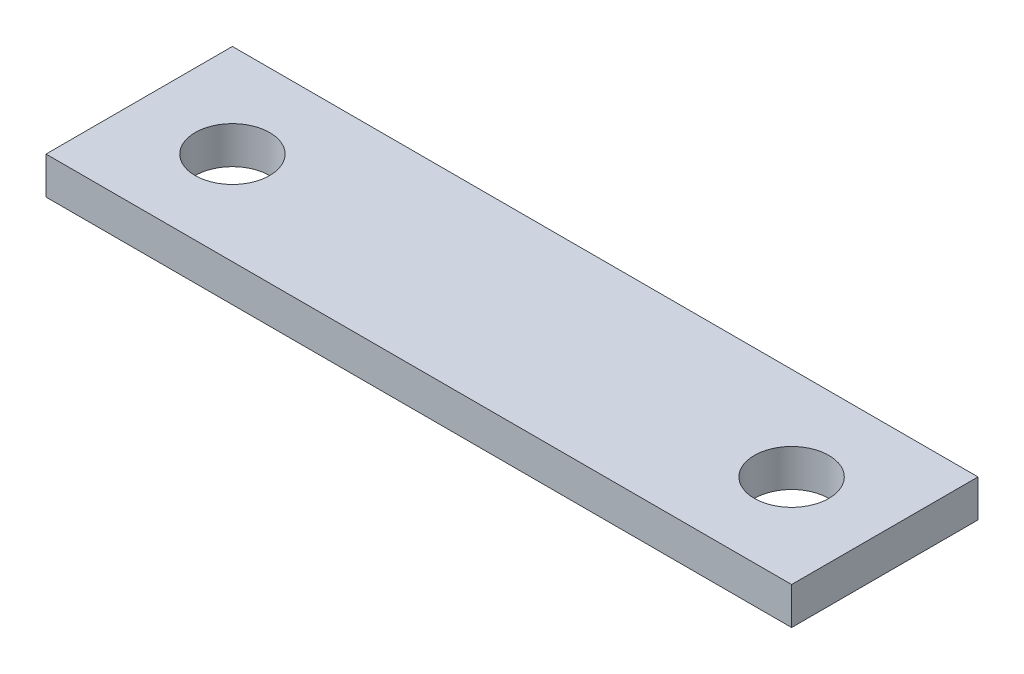
ISO-10303-21;
HEADER;
FILE_DESCRIPTION(('STEP AP214'),'2;1');
FILE_NAME('part.step','',(''),(''),'','','');
FILE_SCHEMA(('AUTOMOTIVE_DESIGN { 1 0 10303 214 1 1 1 1 }'));
ENDSEC;
DATA;
#1=APPLICATION_CONTEXT('core data for automotive mechanical design processes');
#2=APPLICATION_PROTOCOL_DEFINITION('international standard','automotive_design',2000,#1);
#3=PRODUCT_CONTEXT('',#1,'mechanical');
#4=PRODUCT('Part','Part','',(#3));
#5=PRODUCT_RELATED_PRODUCT_CATEGORY('part','',(#4));
#6=PRODUCT_DEFINITION_FORMATION('','',#4);
#7=PRODUCT_DEFINITION_CONTEXT('part definition',#1,'design');
#8=PRODUCT_DEFINITION('design','',#6,#7);
#9=PRODUCT_DEFINITION_SHAPE('','',#8);
#10=(LENGTH_UNIT() NAMED_UNIT(*) SI_UNIT(.MILLI.,.METRE.));
#11=(NAMED_UNIT(*) PLANE_ANGLE_UNIT() SI_UNIT($,.RADIAN.));
#12=(NAMED_UNIT(*) SI_UNIT($,.STERADIAN.) SOLID_ANGLE_UNIT());
#13=UNCERTAINTY_MEASURE_WITH_UNIT(LENGTH_MEASURE(1.E-05),#10,'distance_accuracy_value','');
#14=(GEOMETRIC_REPRESENTATION_CONTEXT(3) GLOBAL_UNCERTAINTY_ASSIGNED_CONTEXT((#13)) GLOBAL_UNIT_ASSIGNED_CONTEXT((#10,
#11,#12)) REPRESENTATION_CONTEXT('',''));
#15=CARTESIAN_POINT('',(0.,0.,0.));
#16=DIRECTION('',(0.,0.,1.));
#17=DIRECTION('',(1.,0.,0.));
#18=AXIS2_PLACEMENT_3D('',#15,#16,#17);
#19=CARTESIAN_POINT('',(0.,6.,0.));
#20=DIRECTION('',(0.,-1.,0.));
#21=DIRECTION('',(0.,0.,-1.));
#22=AXIS2_PLACEMENT_3D('',#19,#20,#21);
#23=PLANE('',#22);
#24=CARTESIAN_POINT('',(15.,6.,-14.9999999999999));
#25=DIRECTION('',(0.,1.,0.));
#26=DIRECTION('',(0.,0.,1.));
#27=AXIS2_PLACEMENT_3D('',#24,#25,#26);
#28=CIRCLE('',#27,6.);
#29=CARTESIAN_POINT('',(15.,6.,-8.9999999999999));
#30=VERTEX_POINT('',#29);
#31=EDGE_CURVE('E99',#30,#30,#28,.T.);
#32=ORIENTED_EDGE('',*,*,#31,.F.);
#33=EDGE_LOOP('',(#32));
#34=FACE_BOUND('',#33,.T.);
#35=DIRECTION('',(0.,0.,1.));
#36=VECTOR('',#35,1.);
#37=CARTESIAN_POINT('',(0.,6.,0.));
#38=LINE('',#37,#36);
#39=CARTESIAN_POINT('',(0.,6.,-30.));
#40=VERTEX_POINT('',#39);
#41=CARTESIAN_POINT('',(0.,6.,0.));
#42=VERTEX_POINT('',#41);
#43=EDGE_CURVE('E84',#40,#42,#38,.T.);
#44=ORIENTED_EDGE('',*,*,#43,.T.);
#45=DIRECTION('',(1.,0.,0.));
#46=VECTOR('',#45,1.);
#47=CARTESIAN_POINT('',(0.,6.,0.));
#48=LINE('',#47,#46);
#49=CARTESIAN_POINT('',(120.,6.,0.));
#50=VERTEX_POINT('',#49);
#51=EDGE_CURVE('E79',#42,#50,#48,.T.);
#52=ORIENTED_EDGE('',*,*,#51,.T.);
#53=DIRECTION('',(0.,0.,-1.));
#54=VECTOR('',#53,1.);
#55=CARTESIAN_POINT('',(120.,6.,0.));
#56=LINE('',#55,#54);
#57=CARTESIAN_POINT('',(120.,6.,-30.));
#58=VERTEX_POINT('',#57);
#59=EDGE_CURVE('E82',#50,#58,#56,.T.);
#60=ORIENTED_EDGE('',*,*,#59,.T.);
#61=DIRECTION('',(-1.,0.,0.));
#62=VECTOR('',#61,1.);
#63=CARTESIAN_POINT('',(0.,6.,-30.));
#64=LINE('',#63,#62);
#65=EDGE_CURVE('E49',#58,#40,#64,.T.);
#66=ORIENTED_EDGE('',*,*,#65,.T.);
#67=EDGE_LOOP('',(#44,#52,#60,#66));
#68=FACE_BOUND('',#67,.T.);
#69=CARTESIAN_POINT('',(105.,6.,-14.9999999999999));
#70=DIRECTION('',(0.,1.,0.));
#71=DIRECTION('',(0.,0.,1.));
#72=AXIS2_PLACEMENT_3D('',#69,#70,#71);
#73=CIRCLE('',#72,6.);
#74=CARTESIAN_POINT('',(105.,6.,-8.9999999999999));
#75=VERTEX_POINT('',#74);
#76=EDGE_CURVE('E114',#75,#75,#73,.T.);
#77=ORIENTED_EDGE('',*,*,#76,.F.);
#78=EDGE_LOOP('',(#77));
#79=FACE_BOUND('',#78,.T.);
#80=ADVANCED_FACE('F32',(#34,#68,#79),#23,.F.);
#81=CARTESIAN_POINT('',(0.,0.,0.));
#82=DIRECTION('',(0.,-1.,0.));
#83=DIRECTION('',(0.,0.,-1.));
#84=AXIS2_PLACEMENT_3D('',#81,#82,#83);
#85=PLANE('',#84);
#86=CARTESIAN_POINT('',(15.,0.,-14.9999999999999));
#87=DIRECTION('',(0.,1.,0.));
#88=DIRECTION('',(0.,0.,1.));
#89=AXIS2_PLACEMENT_3D('',#86,#87,#88);
#90=CIRCLE('',#89,6.);
#91=CARTESIAN_POINT('',(15.,0.,-8.9999999999999));
#92=VERTEX_POINT('',#91);
#93=EDGE_CURVE('E111',#92,#92,#90,.T.);
#94=ORIENTED_EDGE('',*,*,#93,.T.);
#95=EDGE_LOOP('',(#94));
#96=FACE_BOUND('',#95,.T.);
#97=DIRECTION('',(0.,0.,1.));
#98=VECTOR('',#97,1.);
#99=CARTESIAN_POINT('',(0.,0.,0.));
#100=LINE('',#99,#98);
#101=CARTESIAN_POINT('',(0.,0.,-30.));
#102=VERTEX_POINT('',#101);
#103=CARTESIAN_POINT('',(0.,0.,0.));
#104=VERTEX_POINT('',#103);
#105=EDGE_CURVE('E96',#102,#104,#100,.T.);
#106=ORIENTED_EDGE('',*,*,#105,.F.);
#107=DIRECTION('',(-1.,0.,0.));
#108=VECTOR('',#107,1.);
#109=CARTESIAN_POINT('',(0.,0.,-30.));
#110=LINE('',#109,#108);
#111=CARTESIAN_POINT('',(120.,0.,-30.));
#112=VERTEX_POINT('',#111);
#113=EDGE_CURVE('E72',#112,#102,#110,.T.);
#114=ORIENTED_EDGE('',*,*,#113,.F.);
#115=DIRECTION('',(0.,0.,-1.));
#116=VECTOR('',#115,1.);
#117=CARTESIAN_POINT('',(120.,0.,0.));
#118=LINE('',#117,#116);
#119=CARTESIAN_POINT('',(120.,0.,0.));
#120=VERTEX_POINT('',#119);
#121=EDGE_CURVE('E66',#120,#112,#118,.T.);
#122=ORIENTED_EDGE('',*,*,#121,.F.);
#123=DIRECTION('',(1.,0.,0.));
#124=VECTOR('',#123,1.);
#125=CARTESIAN_POINT('',(0.,0.,0.));
#126=LINE('',#125,#124);
#127=EDGE_CURVE('E88',#104,#120,#126,.T.);
#128=ORIENTED_EDGE('',*,*,#127,.F.);
#129=EDGE_LOOP('',(#106,#114,#122,#128));
#130=FACE_BOUND('',#129,.T.);
#131=CARTESIAN_POINT('',(105.,0.,-14.9999999999999));
#132=DIRECTION('',(0.,1.,0.));
#133=DIRECTION('',(0.,0.,1.));
#134=AXIS2_PLACEMENT_3D('',#131,#132,#133);
#135=CIRCLE('',#134,6.);
#136=CARTESIAN_POINT('',(105.,0.,-8.9999999999999));
#137=VERTEX_POINT('',#136);
#138=EDGE_CURVE('E117',#137,#137,#135,.T.);
#139=ORIENTED_EDGE('',*,*,#138,.T.);
#140=EDGE_LOOP('',(#139));
#141=FACE_BOUND('',#140,.T.);
#142=ADVANCED_FACE('F107',(#96,#130,#141),#85,.T.);
#143=CARTESIAN_POINT('',(0.,6.,0.));
#144=DIRECTION('',(1.,0.,0.));
#145=DIRECTION('',(0.,0.,-1.));
#146=AXIS2_PLACEMENT_3D('',#143,#144,#145);
#147=PLANE('',#146);
#148=ORIENTED_EDGE('',*,*,#105,.T.);
#149=DIRECTION('',(0.,-1.,0.));
#150=VECTOR('',#149,1.);
#151=CARTESIAN_POINT('',(0.,6.,0.));
#152=LINE('',#151,#150);
#153=EDGE_CURVE('E11',#42,#104,#152,.T.);
#154=ORIENTED_EDGE('',*,*,#153,.F.);
#155=ORIENTED_EDGE('',*,*,#43,.F.);
#156=DIRECTION('',(0.,-1.,0.));
#157=VECTOR('',#156,1.);
#158=CARTESIAN_POINT('',(0.,6.,-30.));
#159=LINE('',#158,#157);
#160=EDGE_CURVE('E92',#40,#102,#159,.T.);
#161=ORIENTED_EDGE('',*,*,#160,.T.);
#162=EDGE_LOOP('',(#148,#154,#155,#161));
#163=FACE_BOUND('',#162,.T.);
#164=ADVANCED_FACE('F34',(#163),#147,.F.);
#165=CARTESIAN_POINT('',(0.,6.,0.));
#166=DIRECTION('',(0.,0.,-1.));
#167=DIRECTION('',(-1.,0.,0.));
#168=AXIS2_PLACEMENT_3D('',#165,#166,#167);
#169=PLANE('',#168);
#170=ORIENTED_EDGE('',*,*,#127,.T.);
#171=DIRECTION('',(0.,-1.,0.));
#172=VECTOR('',#171,1.);
#173=CARTESIAN_POINT('',(120.,6.,0.));
#174=LINE('',#173,#172);
#175=EDGE_CURVE('E41',#50,#120,#174,.T.);
#176=ORIENTED_EDGE('',*,*,#175,.F.);
#177=ORIENTED_EDGE('',*,*,#51,.F.);
#178=ORIENTED_EDGE('',*,*,#153,.T.);
#179=EDGE_LOOP('',(#170,#176,#177,#178));
#180=FACE_BOUND('',#179,.T.);
#181=ADVANCED_FACE('F87',(#180),#169,.F.);
#182=CARTESIAN_POINT('',(120.,6.,0.));
#183=DIRECTION('',(-1.,0.,0.));
#184=DIRECTION('',(0.,0.,1.));
#185=AXIS2_PLACEMENT_3D('',#182,#183,#184);
#186=PLANE('',#185);
#187=ORIENTED_EDGE('',*,*,#121,.T.);
#188=DIRECTION('',(0.,-1.,0.));
#189=VECTOR('',#188,1.);
#190=CARTESIAN_POINT('',(120.,6.,-30.));
#191=LINE('',#190,#189);
#192=EDGE_CURVE('E89',#58,#112,#191,.T.);
#193=ORIENTED_EDGE('',*,*,#192,.F.);
#194=ORIENTED_EDGE('',*,*,#59,.F.);
#195=ORIENTED_EDGE('',*,*,#175,.T.);
#196=EDGE_LOOP('',(#187,#193,#194,#195));
#197=FACE_BOUND('',#196,.T.);
#198=ADVANCED_FACE('F90',(#197),#186,.F.);
#199=CARTESIAN_POINT('',(0.,6.,-30.));
#200=DIRECTION('',(0.,0.,1.));
#201=DIRECTION('',(1.,0.,0.));
#202=AXIS2_PLACEMENT_3D('',#199,#200,#201);
#203=PLANE('',#202);
#204=ORIENTED_EDGE('',*,*,#113,.T.);
#205=ORIENTED_EDGE('',*,*,#160,.F.);
#206=ORIENTED_EDGE('',*,*,#65,.F.);
#207=ORIENTED_EDGE('',*,*,#192,.T.);
#208=EDGE_LOOP('',(#204,#205,#206,#207));
#209=FACE_BOUND('',#208,.T.);
#210=ADVANCED_FACE('F104',(#209),#203,.F.);
#211=CARTESIAN_POINT('',(15.,6.,-14.9999999999999));
#212=DIRECTION('',(0.,-1.,0.));
#213=DIRECTION('',(0.,0.,-1.));
#214=AXIS2_PLACEMENT_3D('',#211,#212,#213);
#215=CYLINDRICAL_SURFACE('',#214,6.);
#216=ORIENTED_EDGE('',*,*,#31,.T.);
#217=EDGE_LOOP('',(#216));
#218=FACE_BOUND('',#217,.T.);
#219=ORIENTED_EDGE('',*,*,#93,.F.);
#220=EDGE_LOOP('',(#219));
#221=FACE_BOUND('',#220,.T.);
#222=ADVANCED_FACE('F135',(#218,#221),#215,.F.);
#223=CARTESIAN_POINT('',(105.,6.,-14.9999999999999));
#224=DIRECTION('',(0.,-1.,0.));
#225=DIRECTION('',(0.,0.,-1.));
#226=AXIS2_PLACEMENT_3D('',#223,#224,#225);
#227=CYLINDRICAL_SURFACE('',#226,6.);
#228=ORIENTED_EDGE('',*,*,#76,.T.);
#229=EDGE_LOOP('',(#228));
#230=FACE_BOUND('',#229,.T.);
#231=ORIENTED_EDGE('',*,*,#138,.F.);
#232=EDGE_LOOP('',(#231));
#233=FACE_BOUND('',#232,.T.);
#234=ADVANCED_FACE('F123',(#230,#233),#227,.F.);
#235=CLOSED_SHELL('',(#80,#142,#164,#181,#198,#210,#222,#234));
#236=MANIFOLD_SOLID_BREP('B2',#235);
#237=ADVANCED_BREP_SHAPE_REPRESENTATION('',(#18,#236),#14);
#238=SHAPE_DEFINITION_REPRESENTATION(#9,#237);
ENDSEC;
END-ISO-10303-21;
